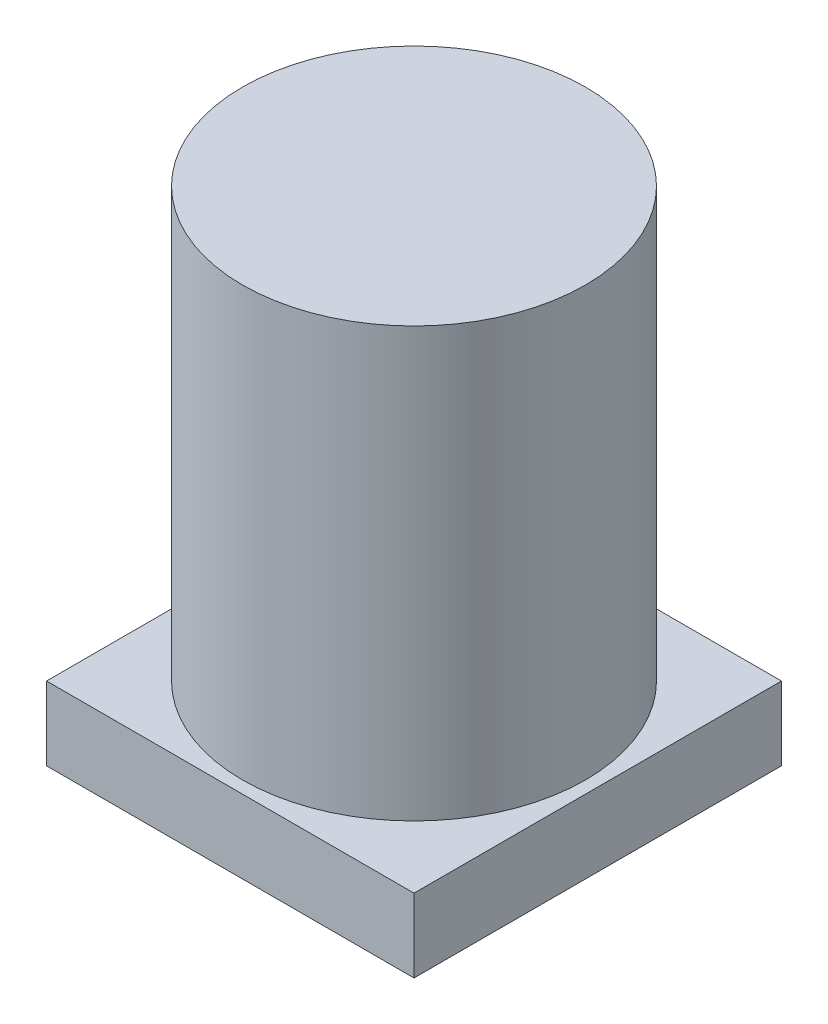
ISO-10303-21;
HEADER;
FILE_DESCRIPTION(('STEP AP214'),'2;1');
FILE_NAME('part.step','',(''),(''),'','','');
FILE_SCHEMA(('AUTOMOTIVE_DESIGN { 1 0 10303 214 1 1 1 1 }'));
ENDSEC;
DATA;
#1=APPLICATION_CONTEXT('core data for automotive mechanical design processes');
#2=APPLICATION_PROTOCOL_DEFINITION('international standard','automotive_design',2000,#1);
#3=PRODUCT_CONTEXT('',#1,'mechanical');
#4=PRODUCT('Part','Part','',(#3));
#5=PRODUCT_RELATED_PRODUCT_CATEGORY('part','',(#4));
#6=PRODUCT_DEFINITION_FORMATION('','',#4);
#7=PRODUCT_DEFINITION_CONTEXT('part definition',#1,'design');
#8=PRODUCT_DEFINITION('design','',#6,#7);
#9=PRODUCT_DEFINITION_SHAPE('','',#8);
#10=(LENGTH_UNIT() NAMED_UNIT(*) SI_UNIT(.MILLI.,.METRE.));
#11=(NAMED_UNIT(*) PLANE_ANGLE_UNIT() SI_UNIT($,.RADIAN.));
#12=(NAMED_UNIT(*) SI_UNIT($,.STERADIAN.) SOLID_ANGLE_UNIT());
#13=UNCERTAINTY_MEASURE_WITH_UNIT(LENGTH_MEASURE(1.E-05),#10,'distance_accuracy_value','');
#14=(GEOMETRIC_REPRESENTATION_CONTEXT(3) GLOBAL_UNCERTAINTY_ASSIGNED_CONTEXT((#13)) GLOBAL_UNIT_ASSIGNED_CONTEXT((#10,
#11,#12)) REPRESENTATION_CONTEXT('',''));
#15=CARTESIAN_POINT('',(0.,0.,0.));
#16=DIRECTION('',(0.,0.,1.));
#17=DIRECTION('',(1.,0.,0.));
#18=AXIS2_PLACEMENT_3D('',#15,#16,#17);
#19=CARTESIAN_POINT('',(0.,5.,0.));
#20=DIRECTION('',(0.,-1.,0.));
#21=DIRECTION('',(0.,0.,-1.));
#22=AXIS2_PLACEMENT_3D('',#19,#20,#21);
#23=PLANE('',#22);
#24=CARTESIAN_POINT('',(0.,5.,0.));
#25=DIRECTION('',(0.,-1.,0.));
#26=DIRECTION('',(0.,0.,-1.));
#27=AXIS2_PLACEMENT_3D('',#24,#25,#26);
#28=CIRCLE('',#27,5.);
#29=CARTESIAN_POINT('',(0.,5.,-5.));
#30=VERTEX_POINT('',#29);
#31=EDGE_CURVE('P0_E130',#30,#30,#28,.T.);
#32=ORIENTED_EDGE('',*,*,#31,.T.);
#33=EDGE_LOOP('',(#32));
#34=FACE_BOUND('',#33,.T.);
#35=ADVANCED_FACE('P0_F17',(#34),#23,.T.);
#36=CARTESIAN_POINT('',(0.,-3.,0.));
#37=DIRECTION('',(0.,-1.,0.));
#38=DIRECTION('',(0.,0.,-1.));
#39=AXIS2_PLACEMENT_3D('',#36,#37,#38);
#40=PLANE('',#39);
#41=CARTESIAN_POINT('',(0.,-3.,0.));
#42=DIRECTION('',(0.,-1.,0.));
#43=DIRECTION('',(0.,0.,-1.));
#44=AXIS2_PLACEMENT_3D('',#41,#42,#43);
#45=CIRCLE('',#44,5.);
#46=CARTESIAN_POINT('',(0.,-3.,-5.));
#47=VERTEX_POINT('',#46);
#48=EDGE_CURVE('P0_E142',#47,#47,#45,.T.);
#49=ORIENTED_EDGE('',*,*,#48,.F.);
#50=EDGE_LOOP('',(#49));
#51=FACE_BOUND('',#50,.T.);
#52=CARTESIAN_POINT('',(0.,-3.,0.));
#53=DIRECTION('',(0.,-1.,0.));
#54=DIRECTION('',(0.,0.,-1.));
#55=AXIS2_PLACEMENT_3D('',#52,#53,#54);
#56=CIRCLE('',#55,20.);
#57=CARTESIAN_POINT('',(0.,-3.,-20.));
#58=VERTEX_POINT('',#57);
#59=EDGE_CURVE('P0_E137',#58,#58,#56,.T.);
#60=ORIENTED_EDGE('',*,*,#59,.T.);
#61=EDGE_LOOP('',(#60));
#62=FACE_BOUND('',#61,.T.);
#63=ADVANCED_FACE('P0_F182',(#51,#62),#40,.T.);
#64=CARTESIAN_POINT('',(0.,82.,0.));
#65=DIRECTION('',(0.,1.,0.));
#66=DIRECTION('',(1.,0.,0.));
#67=AXIS2_PLACEMENT_3D('',#64,#65,#66);
#68=PLANE('',#67);
#69=CARTESIAN_POINT('',(0.,82.,0.));
#70=DIRECTION('',(0.,1.,0.));
#71=DIRECTION('',(0.,0.,1.));
#72=AXIS2_PLACEMENT_3D('',#69,#70,#71);
#73=CIRCLE('',#72,28.);
#74=CARTESIAN_POINT('',(0.,82.,28.));
#75=VERTEX_POINT('',#74);
#76=EDGE_CURVE('P0_E136',#75,#75,#73,.T.);
#77=ORIENTED_EDGE('',*,*,#76,.T.);
#78=EDGE_LOOP('',(#77));
#79=FACE_BOUND('',#78,.T.);
#80=ADVANCED_FACE('P0_F187',(#79),#68,.T.);
#81=CARTESIAN_POINT('',(0.,0.,0.));
#82=DIRECTION('',(0.,1.,0.));
#83=DIRECTION('',(1.,0.,0.));
#84=AXIS2_PLACEMENT_3D('',#81,#82,#83);
#85=PLANE('',#84);
#86=CARTESIAN_POINT('',(0.,0.,0.));
#87=DIRECTION('',(0.,-1.,0.));
#88=DIRECTION('',(0.,0.,-1.));
#89=AXIS2_PLACEMENT_3D('',#86,#87,#88);
#90=CIRCLE('',#89,20.);
#91=CARTESIAN_POINT('',(0.,0.,-20.));
#92=VERTEX_POINT('',#91);
#93=EDGE_CURVE('P0_E141',#92,#92,#90,.T.);
#94=ORIENTED_EDGE('',*,*,#93,.F.);
#95=EDGE_LOOP('',(#94));
#96=FACE_BOUND('',#95,.T.);
#97=CARTESIAN_POINT('',(21.2132034355964,0.,21.2132034355964));
#98=DIRECTION('',(0.,-1.,0.));
#99=DIRECTION('',(0.,0.,-1.));
#100=AXIS2_PLACEMENT_3D('',#97,#98,#99);
#101=CIRCLE('',#100,2.1);
#102=CARTESIAN_POINT('',(21.2132034355964,0.,19.1132034355964));
#103=VERTEX_POINT('',#102);
#104=EDGE_CURVE('P0_E124',#103,#103,#101,.T.);
#105=ORIENTED_EDGE('',*,*,#104,.F.);
#106=EDGE_LOOP('',(#105));
#107=FACE_BOUND('',#106,.T.);
#108=CARTESIAN_POINT('',(-21.2132034355964,0.,21.2132034355964));
#109=DIRECTION('',(0.,-1.,0.));
#110=DIRECTION('',(0.,0.,-1.));
#111=AXIS2_PLACEMENT_3D('',#108,#109,#110);
#112=CIRCLE('',#111,2.1);
#113=CARTESIAN_POINT('',(-21.2132034355964,0.,19.1132034355964));
#114=VERTEX_POINT('',#113);
#115=EDGE_CURVE('P0_E108',#114,#114,#112,.T.);
#116=ORIENTED_EDGE('',*,*,#115,.F.);
#117=EDGE_LOOP('',(#116));
#118=FACE_BOUND('',#117,.T.);
#119=CARTESIAN_POINT('',(-21.2132034355964,0.,-21.2132034355964));
#120=DIRECTION('',(0.,-1.,0.));
#121=DIRECTION('',(0.,0.,-1.));
#122=AXIS2_PLACEMENT_3D('',#119,#120,#121);
#123=CIRCLE('',#122,2.1);
#124=CARTESIAN_POINT('',(-21.2132034355964,0.,-23.3132034355964));
#125=VERTEX_POINT('',#124);
#126=EDGE_CURVE('P0_E117',#125,#125,#123,.T.);
#127=ORIENTED_EDGE('',*,*,#126,.F.);
#128=EDGE_LOOP('',(#127));
#129=FACE_BOUND('',#128,.T.);
#130=CARTESIAN_POINT('',(21.2132034355964,0.,-21.2132034355964));
#131=DIRECTION('',(0.,-1.,0.));
#132=DIRECTION('',(0.,0.,-1.));
#133=AXIS2_PLACEMENT_3D('',#130,#131,#132);
#134=CIRCLE('',#133,2.1);
#135=CARTESIAN_POINT('',(21.2132034355964,0.,-23.3132034355964));
#136=VERTEX_POINT('',#135);
#137=EDGE_CURVE('P0_E103',#136,#136,#134,.T.);
#138=ORIENTED_EDGE('',*,*,#137,.F.);
#139=EDGE_LOOP('',(#138));
#140=FACE_BOUND('',#139,.T.);
#141=DIRECTION('',(0.,0.,1.));
#142=VECTOR('',#141,1.);
#143=CARTESIAN_POINT('',(-30.,0.,-30.));
#144=LINE('',#143,#142);
#145=CARTESIAN_POINT('',(-30.,0.,-30.));
#146=VERTEX_POINT('',#145);
#147=CARTESIAN_POINT('',(-30.,0.,30.));
#148=VERTEX_POINT('',#147);
#149=EDGE_CURVE('P0_E135',#146,#148,#144,.T.);
#150=ORIENTED_EDGE('',*,*,#149,.F.);
#151=DIRECTION('',(-1.,0.,0.));
#152=VECTOR('',#151,1.);
#153=CARTESIAN_POINT('',(30.,0.,-30.));
#154=LINE('',#153,#152);
#155=CARTESIAN_POINT('',(30.,0.,-30.));
#156=VERTEX_POINT('',#155);
#157=EDGE_CURVE('P0_E20',#156,#146,#154,.T.);
#158=ORIENTED_EDGE('',*,*,#157,.F.);
#159=DIRECTION('',(0.,0.,-1.));
#160=VECTOR('',#159,1.);
#161=CARTESIAN_POINT('',(30.,0.,30.));
#162=LINE('',#161,#160);
#163=CARTESIAN_POINT('',(30.,0.,30.));
#164=VERTEX_POINT('',#163);
#165=EDGE_CURVE('P0_E86',#164,#156,#162,.T.);
#166=ORIENTED_EDGE('',*,*,#165,.F.);
#167=DIRECTION('',(1.,0.,0.));
#168=VECTOR('',#167,1.);
#169=CARTESIAN_POINT('',(-30.,0.,30.));
#170=LINE('',#169,#168);
#171=EDGE_CURVE('P0_E89',#148,#164,#170,.T.);
#172=ORIENTED_EDGE('',*,*,#171,.F.);
#173=EDGE_LOOP('',(#150,#158,#166,#172));
#174=FACE_BOUND('',#173,.T.);
#175=ADVANCED_FACE('P0_F166',(#96,#107,#118,#129,#140,#174),#85,.F.);
#176=CARTESIAN_POINT('',(0.,12.,0.));
#177=DIRECTION('',(0.,1.,0.));
#178=DIRECTION('',(1.,0.,0.));
#179=AXIS2_PLACEMENT_3D('',#176,#177,#178);
#180=PLANE('',#179);
#181=CARTESIAN_POINT('',(0.,12.,0.));
#182=DIRECTION('',(0.,1.,0.));
#183=DIRECTION('',(0.,0.,1.));
#184=AXIS2_PLACEMENT_3D('',#181,#182,#183);
#185=CIRCLE('',#184,28.);
#186=CARTESIAN_POINT('',(0.,12.,28.));
#187=VERTEX_POINT('',#186);
#188=EDGE_CURVE('P0_E131',#187,#187,#185,.T.);
#189=ORIENTED_EDGE('',*,*,#188,.F.);
#190=EDGE_LOOP('',(#189));
#191=FACE_BOUND('',#190,.T.);
#192=DIRECTION('',(0.,0.,1.));
#193=VECTOR('',#192,1.);
#194=CARTESIAN_POINT('',(-30.,12.,-30.));
#195=LINE('',#194,#193);
#196=CARTESIAN_POINT('',(-30.,12.,-30.));
#197=VERTEX_POINT('',#196);
#198=CARTESIAN_POINT('',(-30.,12.,30.));
#199=VERTEX_POINT('',#198);
#200=EDGE_CURVE('P0_E81',#197,#199,#195,.T.);
#201=ORIENTED_EDGE('',*,*,#200,.T.);
#202=DIRECTION('',(1.,0.,0.));
#203=VECTOR('',#202,1.);
#204=CARTESIAN_POINT('',(-30.,12.,30.));
#205=LINE('',#204,#203);
#206=CARTESIAN_POINT('',(30.,12.,30.));
#207=VERTEX_POINT('',#206);
#208=EDGE_CURVE('P0_E78',#199,#207,#205,.T.);
#209=ORIENTED_EDGE('',*,*,#208,.T.);
#210=DIRECTION('',(0.,0.,-1.));
#211=VECTOR('',#210,1.);
#212=CARTESIAN_POINT('',(30.,12.,30.));
#213=LINE('',#212,#211);
#214=CARTESIAN_POINT('',(30.,12.,-30.));
#215=VERTEX_POINT('',#214);
#216=EDGE_CURVE('P0_E67',#207,#215,#213,.T.);
#217=ORIENTED_EDGE('',*,*,#216,.T.);
#218=DIRECTION('',(-1.,0.,0.));
#219=VECTOR('',#218,1.);
#220=CARTESIAN_POINT('',(30.,12.,-30.));
#221=LINE('',#220,#219);
#222=EDGE_CURVE('P0_E11',#215,#197,#221,.T.);
#223=ORIENTED_EDGE('',*,*,#222,.T.);
#224=EDGE_LOOP('',(#201,#209,#217,#223));
#225=FACE_BOUND('',#224,.T.);
#226=ADVANCED_FACE('P0_F79',(#191,#225),#180,.T.);
#227=CARTESIAN_POINT('',(30.,12.,-30.));
#228=DIRECTION('',(0.,0.,1.));
#229=DIRECTION('',(1.,0.,0.));
#230=AXIS2_PLACEMENT_3D('',#227,#228,#229);
#231=PLANE('',#230);
#232=ORIENTED_EDGE('',*,*,#157,.T.);
#233=DIRECTION('',(0.,-1.,0.));
#234=VECTOR('',#233,1.);
#235=CARTESIAN_POINT('',(-30.,12.,-30.));
#236=LINE('',#235,#234);
#237=EDGE_CURVE('P0_E97',#197,#146,#236,.T.);
#238=ORIENTED_EDGE('',*,*,#237,.F.);
#239=ORIENTED_EDGE('',*,*,#222,.F.);
#240=DIRECTION('',(0.,-1.,0.));
#241=VECTOR('',#240,1.);
#242=CARTESIAN_POINT('',(30.,12.,-30.));
#243=LINE('',#242,#241);
#244=EDGE_CURVE('P0_E74',#215,#156,#243,.T.);
#245=ORIENTED_EDGE('',*,*,#244,.T.);
#246=EDGE_LOOP('',(#232,#238,#239,#245));
#247=FACE_BOUND('',#246,.T.);
#248=ADVANCED_FACE('P0_F169',(#247),#231,.F.);
#249=CARTESIAN_POINT('',(30.,12.,30.));
#250=DIRECTION('',(-1.,0.,0.));
#251=DIRECTION('',(0.,0.,1.));
#252=AXIS2_PLACEMENT_3D('',#249,#250,#251);
#253=PLANE('',#252);
#254=ORIENTED_EDGE('',*,*,#165,.T.);
#255=ORIENTED_EDGE('',*,*,#244,.F.);
#256=ORIENTED_EDGE('',*,*,#216,.F.);
#257=DIRECTION('',(0.,-1.,0.));
#258=VECTOR('',#257,1.);
#259=CARTESIAN_POINT('',(30.,12.,30.));
#260=LINE('',#259,#258);
#261=EDGE_CURVE('P0_E72',#207,#164,#260,.T.);
#262=ORIENTED_EDGE('',*,*,#261,.T.);
#263=EDGE_LOOP('',(#254,#255,#256,#262));
#264=FACE_BOUND('',#263,.T.);
#265=ADVANCED_FACE('P0_F70',(#264),#253,.F.);
#266=CARTESIAN_POINT('',(-30.,12.,30.));
#267=DIRECTION('',(0.,0.,-1.));
#268=DIRECTION('',(0.,-1.,0.));
#269=AXIS2_PLACEMENT_3D('',#266,#267,#268);
#270=PLANE('',#269);
#271=ORIENTED_EDGE('',*,*,#171,.T.);
#272=ORIENTED_EDGE('',*,*,#261,.F.);
#273=ORIENTED_EDGE('',*,*,#208,.F.);
#274=DIRECTION('',(0.,-1.,0.));
#275=VECTOR('',#274,1.);
#276=CARTESIAN_POINT('',(-30.,12.,30.));
#277=LINE('',#276,#275);
#278=EDGE_CURVE('P0_E152',#199,#148,#277,.T.);
#279=ORIENTED_EDGE('',*,*,#278,.T.);
#280=EDGE_LOOP('',(#271,#272,#273,#279));
#281=FACE_BOUND('',#280,.T.);
#282=ADVANCED_FACE('P0_F88',(#281),#270,.F.);
#283=CARTESIAN_POINT('',(-30.,12.,-30.));
#284=DIRECTION('',(1.,0.,0.));
#285=DIRECTION('',(0.,1.,0.));
#286=AXIS2_PLACEMENT_3D('',#283,#284,#285);
#287=PLANE('',#286);
#288=ORIENTED_EDGE('',*,*,#149,.T.);
#289=ORIENTED_EDGE('',*,*,#278,.F.);
#290=ORIENTED_EDGE('',*,*,#200,.F.);
#291=ORIENTED_EDGE('',*,*,#237,.T.);
#292=EDGE_LOOP('',(#288,#289,#290,#291));
#293=FACE_BOUND('',#292,.T.);
#294=ADVANCED_FACE('P0_F217',(#293),#287,.F.);
#295=CARTESIAN_POINT('',(0.,82.,0.));
#296=DIRECTION('',(0.,-1.,0.));
#297=DIRECTION('',(0.,0.,-1.));
#298=AXIS2_PLACEMENT_3D('',#295,#296,#297);
#299=CYLINDRICAL_SURFACE('',#298,28.);
#300=ORIENTED_EDGE('',*,*,#188,.T.);
#301=EDGE_LOOP('',(#300));
#302=FACE_BOUND('',#301,.T.);
#303=ORIENTED_EDGE('',*,*,#76,.F.);
#304=EDGE_LOOP('',(#303));
#305=FACE_BOUND('',#304,.T.);
#306=ADVANCED_FACE('P0_F203',(#302,#305),#299,.T.);
#307=CARTESIAN_POINT('',(0.,-3.,0.));
#308=DIRECTION('',(0.,1.,0.));
#309=DIRECTION('',(0.,0.,1.));
#310=AXIS2_PLACEMENT_3D('',#307,#308,#309);
#311=CYLINDRICAL_SURFACE('',#310,20.);
#312=ORIENTED_EDGE('',*,*,#93,.T.);
#313=EDGE_LOOP('',(#312));
#314=FACE_BOUND('',#313,.T.);
#315=ORIENTED_EDGE('',*,*,#59,.F.);
#316=EDGE_LOOP('',(#315));
#317=FACE_BOUND('',#316,.T.);
#318=ADVANCED_FACE('P0_F194',(#314,#317),#311,.T.);
#319=CARTESIAN_POINT('',(0.,5.,0.));
#320=DIRECTION('',(0.,-1.,0.));
#321=DIRECTION('',(0.,0.,-1.));
#322=AXIS2_PLACEMENT_3D('',#319,#320,#321);
#323=CYLINDRICAL_SURFACE('',#322,5.);
#324=ORIENTED_EDGE('',*,*,#48,.T.);
#325=EDGE_LOOP('',(#324));
#326=FACE_BOUND('',#325,.T.);
#327=ORIENTED_EDGE('',*,*,#31,.F.);
#328=EDGE_LOOP('',(#327));
#329=FACE_BOUND('',#328,.T.);
#330=ADVANCED_FACE('P0_F191',(#326,#329),#323,.F.);
#331=CARTESIAN_POINT('',(21.2132034355964,10.,21.2132034355964));
#332=DIRECTION('',(0.,-1.,0.));
#333=DIRECTION('',(0.,0.,-1.));
#334=AXIS2_PLACEMENT_3D('',#331,#332,#333);
#335=CONICAL_SURFACE('',#334,2.1,1.02974425867665);
#336=CARTESIAN_POINT('',(21.2132034355964,10.,21.2132034355964));
#337=DIRECTION('',(0.,-1.,0.));
#338=DIRECTION('',(0.,0.,-1.));
#339=AXIS2_PLACEMENT_3D('',#336,#337,#338);
#340=CIRCLE('',#339,2.1);
#341=CARTESIAN_POINT('',(21.2132034355964,10.,19.1132034355964));
#342=VERTEX_POINT('',#341);
#343=EDGE_CURVE('P0_E112',#342,#342,#340,.T.);
#344=ORIENTED_EDGE('',*,*,#343,.T.);
#345=EDGE_LOOP('',(#344));
#346=FACE_BOUND('',#345,.T.);
#347=CARTESIAN_POINT('',(21.2132034355964,11.2618072999579,21.2132034355964));
#348=VERTEX_POINT('',#347);
#349=VERTEX_LOOP('',#348);
#350=FACE_BOUND('',#349,.T.);
#351=ADVANCED_FACE('P0_F193',(#346,#350),#335,.F.);
#352=CARTESIAN_POINT('',(21.2132034355964,0.,21.2132034355964));
#353=DIRECTION('',(0.,-1.,0.));
#354=DIRECTION('',(0.,0.,-1.));
#355=AXIS2_PLACEMENT_3D('',#352,#353,#354);
#356=CYLINDRICAL_SURFACE('',#355,2.1);
#357=ORIENTED_EDGE('',*,*,#104,.T.);
#358=EDGE_LOOP('',(#357));
#359=FACE_BOUND('',#358,.T.);
#360=ORIENTED_EDGE('',*,*,#343,.F.);
#361=EDGE_LOOP('',(#360));
#362=FACE_BOUND('',#361,.T.);
#363=ADVANCED_FACE('P0_F201',(#359,#362),#356,.F.);
#364=CARTESIAN_POINT('',(-21.2132034355964,10.,21.2132034355964));
#365=DIRECTION('',(0.,-1.,0.));
#366=DIRECTION('',(0.,0.,-1.));
#367=AXIS2_PLACEMENT_3D('',#364,#365,#366);
#368=CONICAL_SURFACE('',#367,2.1,1.02974425867665);
#369=CARTESIAN_POINT('',(-21.2132034355964,10.,21.2132034355964));
#370=DIRECTION('',(0.,-1.,0.));
#371=DIRECTION('',(0.,0.,-1.));
#372=AXIS2_PLACEMENT_3D('',#369,#370,#371);
#373=CIRCLE('',#372,2.1);
#374=CARTESIAN_POINT('',(-21.2132034355964,10.,19.1132034355964));
#375=VERTEX_POINT('',#374);
#376=EDGE_CURVE('P0_E113',#375,#375,#373,.T.);
#377=ORIENTED_EDGE('',*,*,#376,.T.);
#378=EDGE_LOOP('',(#377));
#379=FACE_BOUND('',#378,.T.);
#380=CARTESIAN_POINT('',(-21.2132034355964,11.2618072999579,21.2132034355964));
#381=VERTEX_POINT('',#380);
#382=VERTEX_LOOP('',#381);
#383=FACE_BOUND('',#382,.T.);
#384=ADVANCED_FACE('P0_F227',(#379,#383),#368,.F.);
#385=CARTESIAN_POINT('',(-21.2132034355964,0.,21.2132034355964));
#386=DIRECTION('',(0.,-1.,0.));
#387=DIRECTION('',(0.,0.,-1.));
#388=AXIS2_PLACEMENT_3D('',#385,#386,#387);
#389=CYLINDRICAL_SURFACE('',#388,2.1);
#390=ORIENTED_EDGE('',*,*,#115,.T.);
#391=EDGE_LOOP('',(#390));
#392=FACE_BOUND('',#391,.T.);
#393=ORIENTED_EDGE('',*,*,#376,.F.);
#394=EDGE_LOOP('',(#393));
#395=FACE_BOUND('',#394,.T.);
#396=ADVANCED_FACE('P0_F234',(#392,#395),#389,.F.);
#397=CARTESIAN_POINT('',(-21.2132034355964,10.,-21.2132034355964));
#398=DIRECTION('',(0.,-1.,0.));
#399=DIRECTION('',(0.,0.,-1.));
#400=AXIS2_PLACEMENT_3D('',#397,#398,#399);
#401=CONICAL_SURFACE('',#400,2.1,1.02974425867665);
#402=CARTESIAN_POINT('',(-21.2132034355964,10.,-21.2132034355964));
#403=DIRECTION('',(0.,-1.,0.));
#404=DIRECTION('',(0.,0.,-1.));
#405=AXIS2_PLACEMENT_3D('',#402,#403,#404);
#406=CIRCLE('',#405,2.1);
#407=CARTESIAN_POINT('',(-21.2132034355964,10.,-23.3132034355964));
#408=VERTEX_POINT('',#407);
#409=EDGE_CURVE('P0_E107',#408,#408,#406,.T.);
#410=ORIENTED_EDGE('',*,*,#409,.T.);
#411=EDGE_LOOP('',(#410));
#412=FACE_BOUND('',#411,.T.);
#413=CARTESIAN_POINT('',(-21.2132034355964,11.2618072999579,-21.2132034355964));
#414=VERTEX_POINT('',#413);
#415=VERTEX_LOOP('',#414);
#416=FACE_BOUND('',#415,.T.);
#417=ADVANCED_FACE('P0_F260',(#412,#416),#401,.F.);
#418=CARTESIAN_POINT('',(-21.2132034355964,0.,-21.2132034355964));
#419=DIRECTION('',(0.,-1.,0.));
#420=DIRECTION('',(0.,0.,-1.));
#421=AXIS2_PLACEMENT_3D('',#418,#419,#420);
#422=CYLINDRICAL_SURFACE('',#421,2.1);
#423=ORIENTED_EDGE('',*,*,#126,.T.);
#424=EDGE_LOOP('',(#423));
#425=FACE_BOUND('',#424,.T.);
#426=ORIENTED_EDGE('',*,*,#409,.F.);
#427=EDGE_LOOP('',(#426));
#428=FACE_BOUND('',#427,.T.);
#429=ADVANCED_FACE('P0_F262',(#425,#428),#422,.F.);
#430=CARTESIAN_POINT('',(21.2132034355964,10.,-21.2132034355964));
#431=DIRECTION('',(0.,-1.,0.));
#432=DIRECTION('',(0.,0.,-1.));
#433=AXIS2_PLACEMENT_3D('',#430,#431,#432);
#434=CONICAL_SURFACE('',#433,2.1,1.02974425867665);
#435=CARTESIAN_POINT('',(21.2132034355964,10.,-21.2132034355964));
#436=DIRECTION('',(0.,-1.,0.));
#437=DIRECTION('',(0.,0.,-1.));
#438=AXIS2_PLACEMENT_3D('',#435,#436,#437);
#439=CIRCLE('',#438,2.1);
#440=CARTESIAN_POINT('',(21.2132034355964,10.,-23.3132034355964));
#441=VERTEX_POINT('',#440);
#442=EDGE_CURVE('P0_E101',#441,#441,#439,.T.);
#443=ORIENTED_EDGE('',*,*,#442,.T.);
#444=EDGE_LOOP('',(#443));
#445=FACE_BOUND('',#444,.T.);
#446=CARTESIAN_POINT('',(21.2132034355964,11.2618072999579,-21.2132034355964));
#447=VERTEX_POINT('',#446);
#448=VERTEX_LOOP('',#447);
#449=FACE_BOUND('',#448,.T.);
#450=ADVANCED_FACE('P0_F269',(#445,#449),#434,.F.);
#451=CARTESIAN_POINT('',(21.2132034355964,0.,-21.2132034355964));
#452=DIRECTION('',(0.,-1.,0.));
#453=DIRECTION('',(0.,0.,-1.));
#454=AXIS2_PLACEMENT_3D('',#451,#452,#453);
#455=CYLINDRICAL_SURFACE('',#454,2.1);
#456=ORIENTED_EDGE('',*,*,#137,.T.);
#457=EDGE_LOOP('',(#456));
#458=FACE_BOUND('',#457,.T.);
#459=ORIENTED_EDGE('',*,*,#442,.F.);
#460=EDGE_LOOP('',(#459));
#461=FACE_BOUND('',#460,.T.);
#462=ADVANCED_FACE('P0_F356',(#458,#461),#455,.F.);
#463=CLOSED_SHELL('',(#35,#63,#80,#175,#226,#248,#265,#282,#294,#306,#318,#330,#351,#363,#384,
#396,#417,#429,#450,#462));
#464=MANIFOLD_SOLID_BREP('P0_B1',#463);
#465=CARTESIAN_POINT('',(0.,-25.,0.));
#466=DIRECTION('',(0.,1.,0.));
#467=DIRECTION('',(1.,0.,0.));
#468=AXIS2_PLACEMENT_3D('',#465,#466,#467);
#469=PLANE('',#468);
#470=CARTESIAN_POINT('',(0.,-25.,0.));
#471=DIRECTION('',(0.,1.,0.));
#472=DIRECTION('',(0.,0.,1.));
#473=AXIS2_PLACEMENT_3D('',#470,#471,#472);
#474=CIRCLE('',#473,5.);
#475=CARTESIAN_POINT('',(0.,-25.,5.));
#476=VERTEX_POINT('',#475);
#477=EDGE_CURVE('P1_E9',#476,#476,#474,.T.);
#478=ORIENTED_EDGE('',*,*,#477,.F.);
#479=EDGE_LOOP('',(#478));
#480=FACE_BOUND('',#479,.T.);
#481=ADVANCED_FACE('P1_F14',(#480),#469,.F.);
#482=CARTESIAN_POINT('',(0.,5.,0.));
#483=DIRECTION('',(0.,1.,0.));
#484=DIRECTION('',(1.,0.,0.));
#485=AXIS2_PLACEMENT_3D('',#482,#483,#484);
#486=PLANE('',#485);
#487=CARTESIAN_POINT('',(0.,5.,0.));
#488=DIRECTION('',(0.,1.,0.));
#489=DIRECTION('',(0.,0.,1.));
#490=AXIS2_PLACEMENT_3D('',#487,#488,#489);
#491=CIRCLE('',#490,5.);
#492=CARTESIAN_POINT('',(0.,5.,5.));
#493=VERTEX_POINT('',#492);
#494=EDGE_CURVE('P1_E21',#493,#493,#491,.T.);
#495=ORIENTED_EDGE('',*,*,#494,.T.);
#496=EDGE_LOOP('',(#495));
#497=FACE_BOUND('',#496,.T.);
#498=ADVANCED_FACE('P1_F34',(#497),#486,.T.);
#499=CARTESIAN_POINT('',(0.,5.,0.));
#500=DIRECTION('',(0.,-1.,0.));
#501=DIRECTION('',(0.,0.,-1.));
#502=AXIS2_PLACEMENT_3D('',#499,#500,#501);
#503=CYLINDRICAL_SURFACE('',#502,5.);
#504=ORIENTED_EDGE('',*,*,#477,.T.);
#505=EDGE_LOOP('',(#504));
#506=FACE_BOUND('',#505,.T.);
#507=ORIENTED_EDGE('',*,*,#494,.F.);
#508=EDGE_LOOP('',(#507));
#509=FACE_BOUND('',#508,.T.);
#510=ADVANCED_FACE('P1_F36',(#506,#509),#503,.T.);
#511=CLOSED_SHELL('',(#481,#498,#510));
#512=MANIFOLD_SOLID_BREP('P1_B1',#511);
#513=ADVANCED_BREP_SHAPE_REPRESENTATION('',(#18,#464,#512),#14);
#514=SHAPE_DEFINITION_REPRESENTATION(#9,#513);
ENDSEC;
END-ISO-10303-21;
